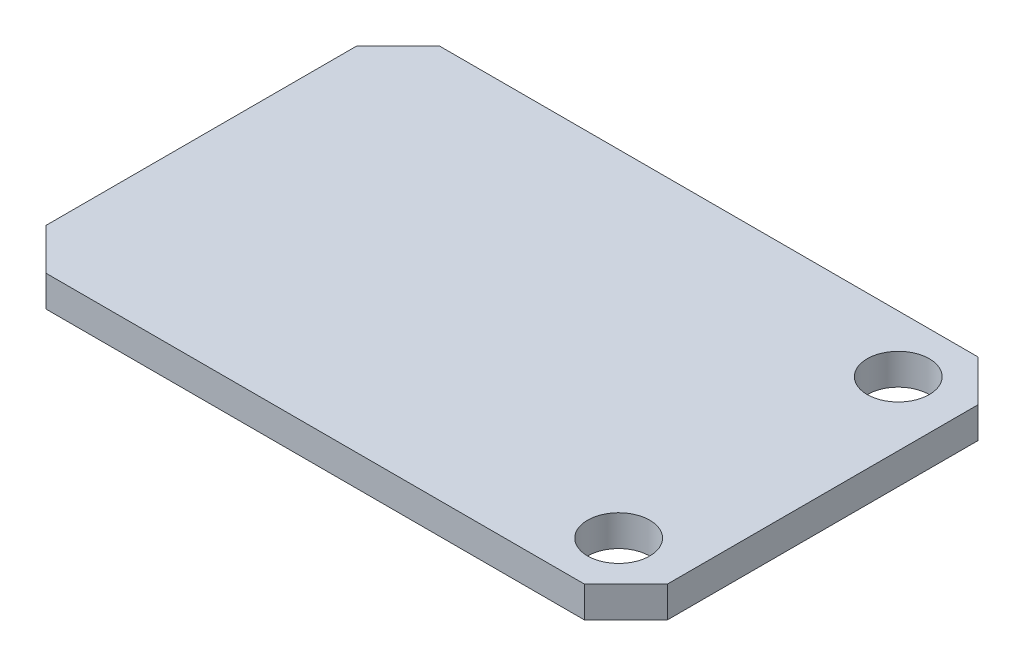
ISO-10303-21;
HEADER;
FILE_DESCRIPTION(('STEP AP214'),'2;1');
FILE_NAME('part.step','',(''),(''),'','','');
FILE_SCHEMA(('AUTOMOTIVE_DESIGN { 1 0 10303 214 1 1 1 1 }'));
ENDSEC;
DATA;
#1=APPLICATION_CONTEXT('core data for automotive mechanical design processes');
#2=APPLICATION_PROTOCOL_DEFINITION('international standard','automotive_design',2000,#1);
#3=PRODUCT_CONTEXT('',#1,'mechanical');
#4=PRODUCT('Part','Part','',(#3));
#5=PRODUCT_RELATED_PRODUCT_CATEGORY('part','',(#4));
#6=PRODUCT_DEFINITION_FORMATION('','',#4);
#7=PRODUCT_DEFINITION_CONTEXT('part definition',#1,'design');
#8=PRODUCT_DEFINITION('design','',#6,#7);
#9=PRODUCT_DEFINITION_SHAPE('','',#8);
#10=(LENGTH_UNIT() NAMED_UNIT(*) SI_UNIT(.MILLI.,.METRE.));
#11=(NAMED_UNIT(*) PLANE_ANGLE_UNIT() SI_UNIT($,.RADIAN.));
#12=(NAMED_UNIT(*) SI_UNIT($,.STERADIAN.) SOLID_ANGLE_UNIT());
#13=UNCERTAINTY_MEASURE_WITH_UNIT(LENGTH_MEASURE(1.E-05),#10,'distance_accuracy_value','');
#14=(GEOMETRIC_REPRESENTATION_CONTEXT(3) GLOBAL_UNCERTAINTY_ASSIGNED_CONTEXT((#13)) GLOBAL_UNIT_ASSIGNED_CONTEXT((#10,
#11,#12)) REPRESENTATION_CONTEXT('',''));
#15=CARTESIAN_POINT('',(0.,0.,0.));
#16=DIRECTION('',(0.,0.,1.));
#17=DIRECTION('',(1.,0.,0.));
#18=AXIS2_PLACEMENT_3D('',#15,#16,#17);
#19=CARTESIAN_POINT('',(0.,1.5,0.));
#20=DIRECTION('',(0.,1.,0.));
#21=DIRECTION('',(0.,0.,1.));
#22=AXIS2_PLACEMENT_3D('',#19,#20,#21);
#23=PLANE('',#22);
#24=CARTESIAN_POINT('',(11.9,1.5,-6.75));
#25=DIRECTION('',(0.,1.,0.));
#26=DIRECTION('',(0.,0.,1.));
#27=AXIS2_PLACEMENT_3D('',#24,#25,#26);
#28=CIRCLE('',#27,1.5);
#29=CARTESIAN_POINT('',(11.9,1.5,-5.25));
#30=VERTEX_POINT('',#29);
#31=EDGE_CURVE('E137',#30,#30,#28,.T.);
#32=ORIENTED_EDGE('',*,*,#31,.F.);
#33=EDGE_LOOP('',(#32));
#34=FACE_BOUND('',#33,.T.);
#35=DIRECTION('',(-1.,0.,0.));
#36=VECTOR('',#35,1.);
#37=CARTESIAN_POINT('',(-15.,1.5,-9.5));
#38=LINE('',#37,#36);
#39=CARTESIAN_POINT('',(13.,1.5,-9.5));
#40=VERTEX_POINT('',#39);
#41=CARTESIAN_POINT('',(-13.,1.5,-9.5));
#42=VERTEX_POINT('',#41);
#43=EDGE_CURVE('E148',#40,#42,#38,.T.);
#44=ORIENTED_EDGE('',*,*,#43,.T.);
#45=DIRECTION('',(0.707106781186549,0.,-0.707106781186546));
#46=VECTOR('',#45,1.);
#47=CARTESIAN_POINT('',(-11.25,1.5,-11.25));
#48=LINE('',#47,#46);
#49=CARTESIAN_POINT('',(-15.,1.5,-7.5));
#50=VERTEX_POINT('',#49);
#51=EDGE_CURVE('E178',#42,#50,#48,.F.);
#52=ORIENTED_EDGE('',*,*,#51,.T.);
#53=DIRECTION('',(0.,0.,1.));
#54=VECTOR('',#53,1.);
#55=CARTESIAN_POINT('',(-15.,1.5,-9.5));
#56=LINE('',#55,#54);
#57=CARTESIAN_POINT('',(-15.,1.5,7.49999999999999));
#58=VERTEX_POINT('',#57);
#59=EDGE_CURVE('E127',#50,#58,#56,.T.);
#60=ORIENTED_EDGE('',*,*,#59,.T.);
#61=DIRECTION('',(-0.707106781186546,0.,-0.707106781186549));
#62=VECTOR('',#61,1.);
#63=CARTESIAN_POINT('',(-11.25,1.5,11.25));
#64=LINE('',#63,#62);
#65=CARTESIAN_POINT('',(-13.,1.5,9.5));
#66=VERTEX_POINT('',#65);
#67=EDGE_CURVE('E170',#58,#66,#64,.F.);
#68=ORIENTED_EDGE('',*,*,#67,.T.);
#69=DIRECTION('',(1.,0.,0.));
#70=VECTOR('',#69,1.);
#71=CARTESIAN_POINT('',(-15.,1.5,9.5));
#72=LINE('',#71,#70);
#73=CARTESIAN_POINT('',(13.,1.5,9.5));
#74=VERTEX_POINT('',#73);
#75=EDGE_CURVE('E193',#66,#74,#72,.T.);
#76=ORIENTED_EDGE('',*,*,#75,.T.);
#77=DIRECTION('',(-0.707106781186549,0.,0.707106781186546));
#78=VECTOR('',#77,1.);
#79=CARTESIAN_POINT('',(11.25,1.5,11.25));
#80=LINE('',#79,#78);
#81=CARTESIAN_POINT('',(15.,1.5,7.5));
#82=VERTEX_POINT('',#81);
#83=EDGE_CURVE('E62',#74,#82,#80,.F.);
#84=ORIENTED_EDGE('',*,*,#83,.T.);
#85=DIRECTION('',(0.,0.,-1.));
#86=VECTOR('',#85,1.);
#87=CARTESIAN_POINT('',(15.,1.5,-9.5));
#88=LINE('',#87,#86);
#89=CARTESIAN_POINT('',(15.,1.5,-7.49999999999999));
#90=VERTEX_POINT('',#89);
#91=EDGE_CURVE('E201',#82,#90,#88,.T.);
#92=ORIENTED_EDGE('',*,*,#91,.T.);
#93=DIRECTION('',(0.707106781186546,0.,0.707106781186549));
#94=VECTOR('',#93,1.);
#95=CARTESIAN_POINT('',(11.25,1.5,-11.25));
#96=LINE('',#95,#94);
#97=EDGE_CURVE('E175',#90,#40,#96,.F.);
#98=ORIENTED_EDGE('',*,*,#97,.T.);
#99=EDGE_LOOP('',(#44,#52,#60,#68,#76,#84,#92,#98));
#100=FACE_BOUND('',#99,.T.);
#101=CARTESIAN_POINT('',(11.9,1.5,6.75));
#102=DIRECTION('',(0.,1.,0.));
#103=DIRECTION('',(0.,0.,1.));
#104=AXIS2_PLACEMENT_3D('',#101,#102,#103);
#105=CIRCLE('',#104,1.5);
#106=CARTESIAN_POINT('',(11.9,1.5,8.25));
#107=VERTEX_POINT('',#106);
#108=EDGE_CURVE('E213',#107,#107,#105,.T.);
#109=ORIENTED_EDGE('',*,*,#108,.F.);
#110=EDGE_LOOP('',(#109));
#111=FACE_BOUND('',#110,.T.);
#112=ADVANCED_FACE('F39',(#34,#100,#111),#23,.T.);
#113=CARTESIAN_POINT('',(0.,0.,0.));
#114=DIRECTION('',(0.,1.,0.));
#115=DIRECTION('',(0.,0.,1.));
#116=AXIS2_PLACEMENT_3D('',#113,#114,#115);
#117=PLANE('',#116);
#118=DIRECTION('',(0.,0.,1.));
#119=VECTOR('',#118,1.);
#120=CARTESIAN_POINT('',(-15.,0.,-9.5));
#121=LINE('',#120,#119);
#122=CARTESIAN_POINT('',(-15.,0.,-7.5));
#123=VERTEX_POINT('',#122);
#124=CARTESIAN_POINT('',(-15.,0.,7.49999999999999));
#125=VERTEX_POINT('',#124);
#126=EDGE_CURVE('E124',#123,#125,#121,.T.);
#127=ORIENTED_EDGE('',*,*,#126,.F.);
#128=DIRECTION('',(-0.707106781186549,0.,0.707106781186546));
#129=VECTOR('',#128,1.);
#130=CARTESIAN_POINT('',(-15.,0.,-7.5));
#131=LINE('',#130,#129);
#132=CARTESIAN_POINT('',(-13.,0.,-9.5));
#133=VERTEX_POINT('',#132);
#134=EDGE_CURVE('E106',#123,#133,#131,.F.);
#135=ORIENTED_EDGE('',*,*,#134,.T.);
#136=DIRECTION('',(-1.,0.,0.));
#137=VECTOR('',#136,1.);
#138=CARTESIAN_POINT('',(-15.,0.,-9.5));
#139=LINE('',#138,#137);
#140=CARTESIAN_POINT('',(13.,0.,-9.5));
#141=VERTEX_POINT('',#140);
#142=EDGE_CURVE('E153',#141,#133,#139,.T.);
#143=ORIENTED_EDGE('',*,*,#142,.F.);
#144=DIRECTION('',(-0.707106781186546,0.,-0.707106781186549));
#145=VECTOR('',#144,1.);
#146=CARTESIAN_POINT('',(13.,0.,-9.5));
#147=LINE('',#146,#145);
#148=CARTESIAN_POINT('',(15.,0.,-7.49999999999999));
#149=VERTEX_POINT('',#148);
#150=EDGE_CURVE('E118',#141,#149,#147,.F.);
#151=ORIENTED_EDGE('',*,*,#150,.T.);
#152=DIRECTION('',(0.,0.,-1.));
#153=VECTOR('',#152,1.);
#154=CARTESIAN_POINT('',(15.,0.,-9.5));
#155=LINE('',#154,#153);
#156=CARTESIAN_POINT('',(15.,0.,7.5));
#157=VERTEX_POINT('',#156);
#158=EDGE_CURVE('E142',#157,#149,#155,.T.);
#159=ORIENTED_EDGE('',*,*,#158,.F.);
#160=DIRECTION('',(0.707106781186549,0.,-0.707106781186546));
#161=VECTOR('',#160,1.);
#162=CARTESIAN_POINT('',(15.,0.,7.5));
#163=LINE('',#162,#161);
#164=CARTESIAN_POINT('',(13.,0.,9.5));
#165=VERTEX_POINT('',#164);
#166=EDGE_CURVE('E160',#157,#165,#163,.F.);
#167=ORIENTED_EDGE('',*,*,#166,.T.);
#168=DIRECTION('',(1.,0.,0.));
#169=VECTOR('',#168,1.);
#170=CARTESIAN_POINT('',(-15.,0.,9.5));
#171=LINE('',#170,#169);
#172=CARTESIAN_POINT('',(-13.,0.,9.5));
#173=VERTEX_POINT('',#172);
#174=EDGE_CURVE('E136',#173,#165,#171,.T.);
#175=ORIENTED_EDGE('',*,*,#174,.F.);
#176=DIRECTION('',(0.707106781186546,0.,0.707106781186549));
#177=VECTOR('',#176,1.);
#178=CARTESIAN_POINT('',(-13.,0.,9.5));
#179=LINE('',#178,#177);
#180=EDGE_CURVE('E129',#173,#125,#179,.F.);
#181=ORIENTED_EDGE('',*,*,#180,.T.);
#182=EDGE_LOOP('',(#127,#135,#143,#151,#159,#167,#175,#181));
#183=FACE_BOUND('',#182,.T.);
#184=CARTESIAN_POINT('',(11.9,0.,-6.75));
#185=DIRECTION('',(0.,1.,0.));
#186=DIRECTION('',(0.,0.,1.));
#187=AXIS2_PLACEMENT_3D('',#184,#185,#186);
#188=CIRCLE('',#187,1.5);
#189=CARTESIAN_POINT('',(11.9,0.,-5.25));
#190=VERTEX_POINT('',#189);
#191=EDGE_CURVE('E145',#190,#190,#188,.T.);
#192=ORIENTED_EDGE('',*,*,#191,.T.);
#193=EDGE_LOOP('',(#192));
#194=FACE_BOUND('',#193,.T.);
#195=CARTESIAN_POINT('',(11.9,0.,6.75));
#196=DIRECTION('',(0.,1.,0.));
#197=DIRECTION('',(0.,0.,1.));
#198=AXIS2_PLACEMENT_3D('',#195,#196,#197);
#199=CIRCLE('',#198,1.5);
#200=CARTESIAN_POINT('',(11.9,0.,8.25));
#201=VERTEX_POINT('',#200);
#202=EDGE_CURVE('E215',#201,#201,#199,.T.);
#203=ORIENTED_EDGE('',*,*,#202,.T.);
#204=EDGE_LOOP('',(#203));
#205=FACE_BOUND('',#204,.T.);
#206=ADVANCED_FACE('F132',(#183,#194,#205),#117,.F.);
#207=CARTESIAN_POINT('',(-15.,1.5,-9.5));
#208=DIRECTION('',(1.,0.,0.));
#209=DIRECTION('',(0.,0.,-1.));
#210=AXIS2_PLACEMENT_3D('',#207,#208,#209);
#211=PLANE('',#210);
#212=ORIENTED_EDGE('',*,*,#59,.F.);
#213=DIRECTION('',(0.,-1.,0.));
#214=VECTOR('',#213,1.);
#215=CARTESIAN_POINT('',(-15.,1.5,-7.5));
#216=LINE('',#215,#214);
#217=EDGE_CURVE('E110',#50,#123,#216,.T.);
#218=ORIENTED_EDGE('',*,*,#217,.T.);
#219=ORIENTED_EDGE('',*,*,#126,.T.);
#220=DIRECTION('',(0.,1.,0.));
#221=VECTOR('',#220,1.);
#222=CARTESIAN_POINT('',(-15.,1.5,7.49999999999999));
#223=LINE('',#222,#221);
#224=EDGE_CURVE('E130',#125,#58,#223,.T.);
#225=ORIENTED_EDGE('',*,*,#224,.T.);
#226=EDGE_LOOP('',(#212,#218,#219,#225));
#227=FACE_BOUND('',#226,.T.);
#228=ADVANCED_FACE('F123',(#227),#211,.F.);
#229=CARTESIAN_POINT('',(-15.,1.5,9.5));
#230=DIRECTION('',(0.,0.,-1.));
#231=DIRECTION('',(-1.,0.,0.));
#232=AXIS2_PLACEMENT_3D('',#229,#230,#231);
#233=PLANE('',#232);
#234=ORIENTED_EDGE('',*,*,#174,.T.);
#235=DIRECTION('',(0.,1.,0.));
#236=VECTOR('',#235,1.);
#237=CARTESIAN_POINT('',(13.,1.5,9.5));
#238=LINE('',#237,#236);
#239=EDGE_CURVE('E11',#165,#74,#238,.T.);
#240=ORIENTED_EDGE('',*,*,#239,.T.);
#241=ORIENTED_EDGE('',*,*,#75,.F.);
#242=DIRECTION('',(0.,-1.,0.));
#243=VECTOR('',#242,1.);
#244=CARTESIAN_POINT('',(-13.,1.5,9.5));
#245=LINE('',#244,#243);
#246=EDGE_CURVE('E48',#66,#173,#245,.T.);
#247=ORIENTED_EDGE('',*,*,#246,.T.);
#248=EDGE_LOOP('',(#234,#240,#241,#247));
#249=FACE_BOUND('',#248,.T.);
#250=ADVANCED_FACE('F191',(#249),#233,.F.);
#251=CARTESIAN_POINT('',(15.,1.5,-9.5));
#252=DIRECTION('',(-1.,0.,0.));
#253=DIRECTION('',(0.,0.,1.));
#254=AXIS2_PLACEMENT_3D('',#251,#252,#253);
#255=PLANE('',#254);
#256=ORIENTED_EDGE('',*,*,#158,.T.);
#257=DIRECTION('',(0.,1.,0.));
#258=VECTOR('',#257,1.);
#259=CARTESIAN_POINT('',(15.,1.5,-7.49999999999999));
#260=LINE('',#259,#258);
#261=EDGE_CURVE('E55',#149,#90,#260,.T.);
#262=ORIENTED_EDGE('',*,*,#261,.T.);
#263=ORIENTED_EDGE('',*,*,#91,.F.);
#264=DIRECTION('',(0.,-1.,0.));
#265=VECTOR('',#264,1.);
#266=CARTESIAN_POINT('',(15.,1.5,7.5));
#267=LINE('',#266,#265);
#268=EDGE_CURVE('E181',#82,#157,#267,.T.);
#269=ORIENTED_EDGE('',*,*,#268,.T.);
#270=EDGE_LOOP('',(#256,#262,#263,#269));
#271=FACE_BOUND('',#270,.T.);
#272=ADVANCED_FACE('F200',(#271),#255,.F.);
#273=CARTESIAN_POINT('',(-15.,1.5,-9.5));
#274=DIRECTION('',(0.,0.,1.));
#275=DIRECTION('',(1.,0.,0.));
#276=AXIS2_PLACEMENT_3D('',#273,#274,#275);
#277=PLANE('',#276);
#278=ORIENTED_EDGE('',*,*,#142,.T.);
#279=DIRECTION('',(0.,1.,0.));
#280=VECTOR('',#279,1.);
#281=CARTESIAN_POINT('',(-13.,1.5,-9.5));
#282=LINE('',#281,#280);
#283=EDGE_CURVE('E111',#133,#42,#282,.T.);
#284=ORIENTED_EDGE('',*,*,#283,.T.);
#285=ORIENTED_EDGE('',*,*,#43,.F.);
#286=DIRECTION('',(0.,-1.,0.));
#287=VECTOR('',#286,1.);
#288=CARTESIAN_POINT('',(13.,1.5,-9.5));
#289=LINE('',#288,#287);
#290=EDGE_CURVE('E117',#40,#141,#289,.T.);
#291=ORIENTED_EDGE('',*,*,#290,.T.);
#292=EDGE_LOOP('',(#278,#284,#285,#291));
#293=FACE_BOUND('',#292,.T.);
#294=ADVANCED_FACE('F238',(#293),#277,.F.);
#295=CARTESIAN_POINT('',(11.9,1.5,-6.75));
#296=DIRECTION('',(0.,-1.,0.));
#297=DIRECTION('',(0.,0.,-1.));
#298=AXIS2_PLACEMENT_3D('',#295,#296,#297);
#299=CYLINDRICAL_SURFACE('',#298,1.5);
#300=ORIENTED_EDGE('',*,*,#31,.T.);
#301=EDGE_LOOP('',(#300));
#302=FACE_BOUND('',#301,.T.);
#303=ORIENTED_EDGE('',*,*,#191,.F.);
#304=EDGE_LOOP('',(#303));
#305=FACE_BOUND('',#304,.T.);
#306=ADVANCED_FACE('F235',(#302,#305),#299,.F.);
#307=CARTESIAN_POINT('',(11.9,1.5,6.75));
#308=DIRECTION('',(0.,-1.,0.));
#309=DIRECTION('',(0.,0.,-1.));
#310=AXIS2_PLACEMENT_3D('',#307,#308,#309);
#311=CYLINDRICAL_SURFACE('',#310,1.5);
#312=ORIENTED_EDGE('',*,*,#108,.T.);
#313=EDGE_LOOP('',(#312));
#314=FACE_BOUND('',#313,.T.);
#315=ORIENTED_EDGE('',*,*,#202,.F.);
#316=EDGE_LOOP('',(#315));
#317=FACE_BOUND('',#316,.T.);
#318=ADVANCED_FACE('F223',(#314,#317),#311,.F.);
#319=CARTESIAN_POINT('',(-15.,1.5,-7.5));
#320=DIRECTION('',(0.707106781186546,0.,0.707106781186549));
#321=DIRECTION('',(0.,-1.,0.));
#322=AXIS2_PLACEMENT_3D('',#319,#320,#321);
#323=PLANE('',#322);
#324=ORIENTED_EDGE('',*,*,#51,.F.);
#325=ORIENTED_EDGE('',*,*,#283,.F.);
#326=ORIENTED_EDGE('',*,*,#134,.F.);
#327=ORIENTED_EDGE('',*,*,#217,.F.);
#328=EDGE_LOOP('',(#324,#325,#326,#327));
#329=FACE_BOUND('',#328,.T.);
#330=ADVANCED_FACE('F109',(#329),#323,.F.);
#331=CARTESIAN_POINT('',(13.,1.5,-9.5));
#332=DIRECTION('',(-0.707106781186549,0.,0.707106781186546));
#333=DIRECTION('',(0.,-1.,0.));
#334=AXIS2_PLACEMENT_3D('',#331,#332,#333);
#335=PLANE('',#334);
#336=ORIENTED_EDGE('',*,*,#97,.F.);
#337=ORIENTED_EDGE('',*,*,#261,.F.);
#338=ORIENTED_EDGE('',*,*,#150,.F.);
#339=ORIENTED_EDGE('',*,*,#290,.F.);
#340=EDGE_LOOP('',(#336,#337,#338,#339));
#341=FACE_BOUND('',#340,.T.);
#342=ADVANCED_FACE('F250',(#341),#335,.F.);
#343=CARTESIAN_POINT('',(15.,1.5,7.5));
#344=DIRECTION('',(-0.707106781186546,0.,-0.707106781186549));
#345=DIRECTION('',(0.,-1.,0.));
#346=AXIS2_PLACEMENT_3D('',#343,#344,#345);
#347=PLANE('',#346);
#348=ORIENTED_EDGE('',*,*,#83,.F.);
#349=ORIENTED_EDGE('',*,*,#239,.F.);
#350=ORIENTED_EDGE('',*,*,#166,.F.);
#351=ORIENTED_EDGE('',*,*,#268,.F.);
#352=EDGE_LOOP('',(#348,#349,#350,#351));
#353=FACE_BOUND('',#352,.T.);
#354=ADVANCED_FACE('F199',(#353),#347,.F.);
#355=CARTESIAN_POINT('',(-13.,1.5,9.5));
#356=DIRECTION('',(0.707106781186549,0.,-0.707106781186546));
#357=DIRECTION('',(0.,-1.,0.));
#358=AXIS2_PLACEMENT_3D('',#355,#356,#357);
#359=PLANE('',#358);
#360=ORIENTED_EDGE('',*,*,#67,.F.);
#361=ORIENTED_EDGE('',*,*,#224,.F.);
#362=ORIENTED_EDGE('',*,*,#180,.F.);
#363=ORIENTED_EDGE('',*,*,#246,.F.);
#364=EDGE_LOOP('',(#360,#361,#362,#363));
#365=FACE_BOUND('',#364,.T.);
#366=ADVANCED_FACE('F41',(#365),#359,.F.);
#367=CLOSED_SHELL('',(#112,#206,#228,#250,#272,#294,#306,#318,#330,#342,#354,#366));
#368=MANIFOLD_SOLID_BREP('B2',#367);
#369=ADVANCED_BREP_SHAPE_REPRESENTATION('',(#18,#368),#14);
#370=SHAPE_DEFINITION_REPRESENTATION(#9,#369);
ENDSEC;
END-ISO-10303-21;
